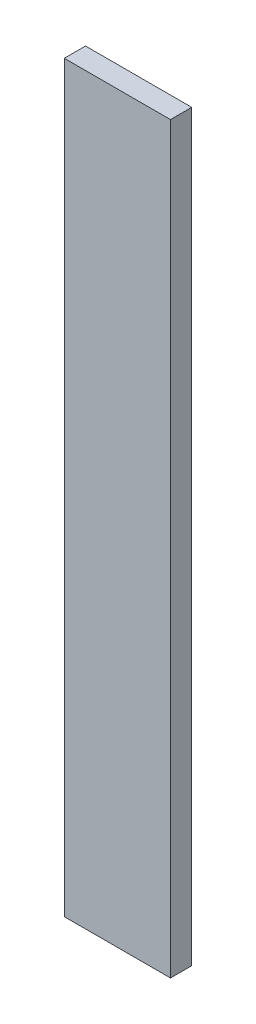
ISO-10303-21;
HEADER;
FILE_DESCRIPTION(('STEP AP214'),'2;1');
FILE_NAME('part.step','',(''),(''),'','','');
FILE_SCHEMA(('AUTOMOTIVE_DESIGN { 1 0 10303 214 1 1 1 1 }'));
ENDSEC;
DATA;
#1=APPLICATION_CONTEXT('core data for automotive mechanical design processes');
#2=APPLICATION_PROTOCOL_DEFINITION('international standard','automotive_design',2000,#1);
#3=PRODUCT_CONTEXT('',#1,'mechanical');
#4=PRODUCT('Part','Part','',(#3));
#5=PRODUCT_RELATED_PRODUCT_CATEGORY('part','',(#4));
#6=PRODUCT_DEFINITION_FORMATION('','',#4);
#7=PRODUCT_DEFINITION_CONTEXT('part definition',#1,'design');
#8=PRODUCT_DEFINITION('design','',#6,#7);
#9=PRODUCT_DEFINITION_SHAPE('','',#8);
#10=(LENGTH_UNIT() NAMED_UNIT(*) SI_UNIT(.MILLI.,.METRE.));
#11=(NAMED_UNIT(*) PLANE_ANGLE_UNIT() SI_UNIT($,.RADIAN.));
#12=(NAMED_UNIT(*) SI_UNIT($,.STERADIAN.) SOLID_ANGLE_UNIT());
#13=UNCERTAINTY_MEASURE_WITH_UNIT(LENGTH_MEASURE(1.E-05),#10,'distance_accuracy_value','');
#14=(GEOMETRIC_REPRESENTATION_CONTEXT(3) GLOBAL_UNCERTAINTY_ASSIGNED_CONTEXT((#13)) GLOBAL_UNIT_ASSIGNED_CONTEXT((#10,
#11,#12)) REPRESENTATION_CONTEXT('',''));
#15=CARTESIAN_POINT('',(0.,0.,0.));
#16=DIRECTION('',(0.,0.,1.));
#17=DIRECTION('',(1.,0.,0.));
#18=AXIS2_PLACEMENT_3D('',#15,#16,#17);
#19=CARTESIAN_POINT('',(-12.7,177.8,2.54));
#20=DIRECTION('',(1.,0.,0.));
#21=DIRECTION('',(0.,0.,-1.));
#22=AXIS2_PLACEMENT_3D('',#19,#20,#21);
#23=PLANE('',#22);
#24=DIRECTION('',(0.,0.,1.));
#25=VECTOR('',#24,1.);
#26=CARTESIAN_POINT('',(-12.7,0.,2.54));
#27=LINE('',#26,#25);
#28=CARTESIAN_POINT('',(-12.7,0.,-2.54));
#29=VERTEX_POINT('',#28);
#30=CARTESIAN_POINT('',(-12.7,0.,2.54));
#31=VERTEX_POINT('',#30);
#32=EDGE_CURVE('E97',#29,#31,#27,.T.);
#33=ORIENTED_EDGE('',*,*,#32,.T.);
#34=DIRECTION('',(0.,-1.,0.));
#35=VECTOR('',#34,1.);
#36=CARTESIAN_POINT('',(-12.7,177.8,2.54));
#37=LINE('',#36,#35);
#38=CARTESIAN_POINT('',(-12.7,177.8,2.54));
#39=VERTEX_POINT('',#38);
#40=EDGE_CURVE('E11',#39,#31,#37,.T.);
#41=ORIENTED_EDGE('',*,*,#40,.F.);
#42=DIRECTION('',(0.,0.,1.));
#43=VECTOR('',#42,1.);
#44=CARTESIAN_POINT('',(-12.7,177.8,2.54));
#45=LINE('',#44,#43);
#46=CARTESIAN_POINT('',(-12.7,177.8,-2.54));
#47=VERTEX_POINT('',#46);
#48=EDGE_CURVE('E85',#47,#39,#45,.T.);
#49=ORIENTED_EDGE('',*,*,#48,.F.);
#50=DIRECTION('',(0.,-1.,0.));
#51=VECTOR('',#50,1.);
#52=CARTESIAN_POINT('',(-12.7,177.8,-2.54));
#53=LINE('',#52,#51);
#54=EDGE_CURVE('E93',#47,#29,#53,.T.);
#55=ORIENTED_EDGE('',*,*,#54,.T.);
#56=EDGE_LOOP('',(#33,#41,#49,#55));
#57=FACE_BOUND('',#56,.T.);
#58=ADVANCED_FACE('F34',(#57),#23,.F.);
#59=CARTESIAN_POINT('',(12.7,177.8,2.54));
#60=DIRECTION('',(0.,0.,-1.));
#61=DIRECTION('',(-1.,0.,0.));
#62=AXIS2_PLACEMENT_3D('',#59,#60,#61);
#63=PLANE('',#62);
#64=DIRECTION('',(1.,0.,0.));
#65=VECTOR('',#64,1.);
#66=CARTESIAN_POINT('',(12.7,0.,2.54));
#67=LINE('',#66,#65);
#68=CARTESIAN_POINT('',(12.7,0.,2.54));
#69=VERTEX_POINT('',#68);
#70=EDGE_CURVE('E89',#31,#69,#67,.T.);
#71=ORIENTED_EDGE('',*,*,#70,.T.);
#72=DIRECTION('',(0.,-1.,0.));
#73=VECTOR('',#72,1.);
#74=CARTESIAN_POINT('',(12.7,177.8,2.54));
#75=LINE('',#74,#73);
#76=CARTESIAN_POINT('',(12.7,177.8,2.54));
#77=VERTEX_POINT('',#76);
#78=EDGE_CURVE('E42',#77,#69,#75,.T.);
#79=ORIENTED_EDGE('',*,*,#78,.F.);
#80=DIRECTION('',(1.,0.,0.));
#81=VECTOR('',#80,1.);
#82=CARTESIAN_POINT('',(12.7,177.8,2.54));
#83=LINE('',#82,#81);
#84=EDGE_CURVE('E80',#39,#77,#83,.T.);
#85=ORIENTED_EDGE('',*,*,#84,.F.);
#86=ORIENTED_EDGE('',*,*,#40,.T.);
#87=EDGE_LOOP('',(#71,#79,#85,#86));
#88=FACE_BOUND('',#87,.T.);
#89=ADVANCED_FACE('F88',(#88),#63,.F.);
#90=CARTESIAN_POINT('',(12.7,177.8,2.54));
#91=DIRECTION('',(-1.,0.,0.));
#92=DIRECTION('',(0.,0.,1.));
#93=AXIS2_PLACEMENT_3D('',#90,#91,#92);
#94=PLANE('',#93);
#95=DIRECTION('',(0.,0.,-1.));
#96=VECTOR('',#95,1.);
#97=CARTESIAN_POINT('',(12.7,0.,2.54));
#98=LINE('',#97,#96);
#99=CARTESIAN_POINT('',(12.7,0.,-2.54));
#100=VERTEX_POINT('',#99);
#101=EDGE_CURVE('E67',#69,#100,#98,.T.);
#102=ORIENTED_EDGE('',*,*,#101,.T.);
#103=DIRECTION('',(0.,-1.,0.));
#104=VECTOR('',#103,1.);
#105=CARTESIAN_POINT('',(12.7,177.8,-2.54));
#106=LINE('',#105,#104);
#107=CARTESIAN_POINT('',(12.7,177.8,-2.54));
#108=VERTEX_POINT('',#107);
#109=EDGE_CURVE('E90',#108,#100,#106,.T.);
#110=ORIENTED_EDGE('',*,*,#109,.F.);
#111=DIRECTION('',(0.,0.,-1.));
#112=VECTOR('',#111,1.);
#113=CARTESIAN_POINT('',(12.7,177.8,2.54));
#114=LINE('',#113,#112);
#115=EDGE_CURVE('E83',#77,#108,#114,.T.);
#116=ORIENTED_EDGE('',*,*,#115,.F.);
#117=ORIENTED_EDGE('',*,*,#78,.T.);
#118=EDGE_LOOP('',(#102,#110,#116,#117));
#119=FACE_BOUND('',#118,.T.);
#120=ADVANCED_FACE('F91',(#119),#94,.F.);
#121=CARTESIAN_POINT('',(12.7,177.8,-2.54));
#122=DIRECTION('',(0.,0.,1.));
#123=DIRECTION('',(1.,0.,0.));
#124=AXIS2_PLACEMENT_3D('',#121,#122,#123);
#125=PLANE('',#124);
#126=DIRECTION('',(-1.,0.,0.));
#127=VECTOR('',#126,1.);
#128=CARTESIAN_POINT('',(12.7,0.,-2.54));
#129=LINE('',#128,#127);
#130=EDGE_CURVE('E73',#100,#29,#129,.T.);
#131=ORIENTED_EDGE('',*,*,#130,.T.);
#132=ORIENTED_EDGE('',*,*,#54,.F.);
#133=DIRECTION('',(-1.,0.,0.));
#134=VECTOR('',#133,1.);
#135=CARTESIAN_POINT('',(12.7,177.8,-2.54));
#136=LINE('',#135,#134);
#137=EDGE_CURVE('E50',#108,#47,#136,.T.);
#138=ORIENTED_EDGE('',*,*,#137,.F.);
#139=ORIENTED_EDGE('',*,*,#109,.T.);
#140=EDGE_LOOP('',(#131,#132,#138,#139));
#141=FACE_BOUND('',#140,.T.);
#142=ADVANCED_FACE('F104',(#141),#125,.F.);
#143=CARTESIAN_POINT('',(0.,177.8,0.));
#144=DIRECTION('',(0.,1.,0.));
#145=DIRECTION('',(0.,0.,1.));
#146=AXIS2_PLACEMENT_3D('',#143,#144,#145);
#147=PLANE('',#146);
#148=ORIENTED_EDGE('',*,*,#48,.T.);
#149=ORIENTED_EDGE('',*,*,#84,.T.);
#150=ORIENTED_EDGE('',*,*,#115,.T.);
#151=ORIENTED_EDGE('',*,*,#137,.T.);
#152=EDGE_LOOP('',(#148,#149,#150,#151));
#153=FACE_BOUND('',#152,.T.);
#154=ADVANCED_FACE('F81',(#153),#147,.T.);
#155=CARTESIAN_POINT('',(0.,0.,0.));
#156=DIRECTION('',(0.,1.,0.));
#157=DIRECTION('',(0.,0.,1.));
#158=AXIS2_PLACEMENT_3D('',#155,#156,#157);
#159=PLANE('',#158);
#160=ORIENTED_EDGE('',*,*,#32,.F.);
#161=ORIENTED_EDGE('',*,*,#130,.F.);
#162=ORIENTED_EDGE('',*,*,#101,.F.);
#163=ORIENTED_EDGE('',*,*,#70,.F.);
#164=EDGE_LOOP('',(#160,#161,#162,#163));
#165=FACE_BOUND('',#164,.T.);
#166=ADVANCED_FACE('F107',(#165),#159,.F.);
#167=CLOSED_SHELL('',(#58,#89,#120,#142,#154,#166));
#168=MANIFOLD_SOLID_BREP('B2',#167);
#169=ADVANCED_BREP_SHAPE_REPRESENTATION('',(#18,#168),#14);
#170=SHAPE_DEFINITION_REPRESENTATION(#9,#169);
ENDSEC;
END-ISO-10303-21;
